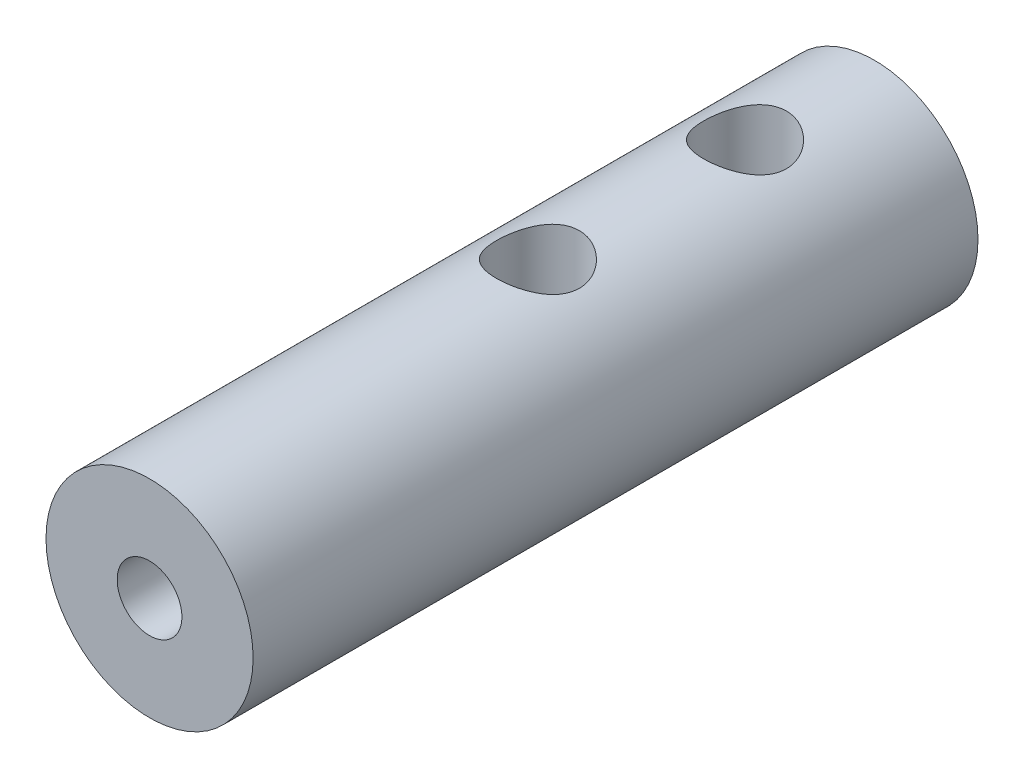
ISO-10303-21;
HEADER;
FILE_DESCRIPTION(('STEP AP214'),'2;1');
FILE_NAME('part.step','',(''),(''),'','','');
FILE_SCHEMA(('AUTOMOTIVE_DESIGN { 1 0 10303 214 1 1 1 1 }'));
ENDSEC;
DATA;
#1=APPLICATION_CONTEXT('core data for automotive mechanical design processes');
#2=APPLICATION_PROTOCOL_DEFINITION('international standard','automotive_design',2000,#1);
#3=PRODUCT_CONTEXT('',#1,'mechanical');
#4=PRODUCT('Part','Part','',(#3));
#5=PRODUCT_RELATED_PRODUCT_CATEGORY('part','',(#4));
#6=PRODUCT_DEFINITION_FORMATION('','',#4);
#7=PRODUCT_DEFINITION_CONTEXT('part definition',#1,'design');
#8=PRODUCT_DEFINITION('design','',#6,#7);
#9=PRODUCT_DEFINITION_SHAPE('','',#8);
#10=(LENGTH_UNIT() NAMED_UNIT(*) SI_UNIT(.MILLI.,.METRE.));
#11=(NAMED_UNIT(*) PLANE_ANGLE_UNIT() SI_UNIT($,.RADIAN.));
#12=(NAMED_UNIT(*) SI_UNIT($,.STERADIAN.) SOLID_ANGLE_UNIT());
#13=UNCERTAINTY_MEASURE_WITH_UNIT(LENGTH_MEASURE(1.E-05),#10,'distance_accuracy_value','');
#14=(GEOMETRIC_REPRESENTATION_CONTEXT(3) GLOBAL_UNCERTAINTY_ASSIGNED_CONTEXT((#13)) GLOBAL_UNIT_ASSIGNED_CONTEXT((#10,
#11,#12)) REPRESENTATION_CONTEXT('',''));
#15=CARTESIAN_POINT('',(0.,0.,0.));
#16=DIRECTION('',(0.,0.,1.));
#17=DIRECTION('',(1.,0.,0.));
#18=AXIS2_PLACEMENT_3D('',#15,#16,#17);
#19=CARTESIAN_POINT('',(0.,0.,28.));
#20=DIRECTION('',(0.,0.,-1.));
#21=DIRECTION('',(-1.,0.,0.));
#22=AXIS2_PLACEMENT_3D('',#19,#20,#21);
#23=CYLINDRICAL_SURFACE('',#22,4.);
#24=CARTESIAN_POINT('',(0.,-4.,6.6));
#25=CARTESIAN_POINT('',(0.085994404354313,-3.99999416981668,6.59999211854102));
#26=CARTESIAN_POINT('',(0.172138051272539,-3.99719435445546,6.5930257983293));
#27=CARTESIAN_POINT('',(0.341997184334317,-3.98626762480513,6.56540183718301));
#28=CARTESIAN_POINT('',(0.425705422048998,-3.97812622959102,6.54470697673109));
#29=CARTESIAN_POINT('',(0.587963138181922,-3.95739367370495,6.49049913755294));
#30=CARTESIAN_POINT('',(0.666528529293567,-3.94481709091258,6.45702812302662));
#31=CARTESIAN_POINT('',(0.816857576262694,-3.91645288636863,6.37838466133876));
#32=CARTESIAN_POINT('',(0.888623581400794,-3.90066637966445,6.33321627606486));
#33=CARTESIAN_POINT('',(1.02680080605631,-3.86664708936335,6.23021160115125));
#34=CARTESIAN_POINT('',(1.09284981804017,-3.84833837543352,6.17191467500779));
#35=CARTESIAN_POINT('',(1.21454000382778,-3.81168461524956,6.04527999721858));
#36=CARTESIAN_POINT('',(1.27017608570683,-3.79333955563034,5.97693736223061));
#37=CARTESIAN_POINT('',(1.3718996538343,-3.75778233437709,5.82845754380619));
#38=CARTESIAN_POINT('',(1.41745198495638,-3.74065692771961,5.74793081118144));
#39=CARTESIAN_POINT('',(1.49420377522972,-3.71066917749434,5.57957088126397));
#40=CARTESIAN_POINT('',(1.52541005142867,-3.69780480995341,5.49174117772131));
#41=CARTESIAN_POINT('',(1.57111905871669,-3.67861086128655,5.31543013312632));
#42=CARTESIAN_POINT('',(1.58631517264452,-3.67201136284484,5.22715901153903));
#43=CARTESIAN_POINT('',(1.60173836931202,-3.66531203239315,5.04909200135419));
#44=CARTESIAN_POINT('',(1.60197281305058,-3.66520900418215,4.95929688429999));
#45=CARTESIAN_POINT('',(1.58799149400364,-3.67128400223995,4.78739466283357));
#46=CARTESIAN_POINT('',(1.57478025144411,-3.6770254003076,4.70518742847278));
#47=CARTESIAN_POINT('',(1.53595750423826,-3.69340950086269,4.54427235519463));
#48=CARTESIAN_POINT('',(1.5103438358437,-3.70405305857338,4.46556512951175));
#49=CARTESIAN_POINT('',(1.44695578604086,-3.72927588070824,4.31198573104317));
#50=CARTESIAN_POINT('',(1.40894388985225,-3.7439310342463,4.23722460875625));
#51=CARTESIAN_POINT('',(1.32200516858577,-3.77550493111912,4.09486734691075));
#52=CARTESIAN_POINT('',(1.27307424408067,-3.79242452365479,4.02727391247776));
#53=CARTESIAN_POINT('',(1.16124047956355,-3.82821389393817,3.8956722169584));
#54=CARTESIAN_POINT('',(1.09754997037651,-3.84713331980921,3.83234501644319));
#55=CARTESIAN_POINT('',(0.960251541944154,-3.88367859966626,3.71705241759837));
#56=CARTESIAN_POINT('',(0.886641652267547,-3.9013041955626,3.66508928207177));
#57=CARTESIAN_POINT('',(0.729662122084675,-3.93371745011639,3.57310604206734));
#58=CARTESIAN_POINT('',(0.646128393077182,-3.94844216076332,3.53334217504236));
#59=CARTESIAN_POINT('',(0.472819012386306,-3.97291862663007,3.46866571113756));
#60=CARTESIAN_POINT('',(0.383046557479739,-3.98267290769906,3.44374556995407));
#61=CARTESIAN_POINT('',(0.205516710086256,-3.99564911605528,3.41084136366424));
#62=CARTESIAN_POINT('',(0.117954635188428,-3.99922356666811,3.40194203659715));
#63=CARTESIAN_POINT('',(-0.0574762478462539,-4.00054782808505,3.39862951957711));
#64=CARTESIAN_POINT('',(-0.145344970579139,-3.99829914865833,3.40421257476199));
#65=CARTESIAN_POINT('',(-0.31474619129759,-3.98846053651002,3.42903340204159));
#66=CARTESIAN_POINT('',(-0.39638599342038,-3.98111513076419,3.44764638428078));
#67=CARTESIAN_POINT('',(-0.555308342448625,-3.962075531244,3.49714856664785));
#68=CARTESIAN_POINT('',(-0.632590328179876,-3.95038077885224,3.52803934373495));
#69=CARTESIAN_POINT('',(-0.783263028653362,-3.92333275816649,3.60222795174396));
#70=CARTESIAN_POINT('',(-0.856462418204325,-3.90787852783843,3.64587637763452));
#71=CARTESIAN_POINT('',(-0.994754872997244,-3.8749869179642,3.74395225912452));
#72=CARTESIAN_POINT('',(-1.0598446726089,-3.85754874488216,3.79838403433809));
#73=CARTESIAN_POINT('',(-1.18457843442306,-3.82116094110489,3.9206960103597));
#74=CARTESIAN_POINT('',(-1.24357914704485,-3.80218753140042,3.98922683320497));
#75=CARTESIAN_POINT('',(-1.34940095793097,-3.76593338333706,4.1355520664075));
#76=CARTESIAN_POINT('',(-1.39622004907001,-3.74865292421209,4.21334800027196));
#77=CARTESIAN_POINT('',(-1.4766460015453,-3.71771439926167,4.37716935567528));
#78=CARTESIAN_POINT('',(-1.51012047562756,-3.7040930470783,4.46326719936985));
#79=CARTESIAN_POINT('',(-1.56183697576424,-3.68258938782345,4.64058692137213));
#80=CARTESIAN_POINT('',(-1.58009024421545,-3.67470284556799,4.73180496464994));
#81=CARTESIAN_POINT('',(-1.59977249382272,-3.66617407439941,4.90970232141964));
#82=CARTESIAN_POINT('',(-1.60231766584229,-3.66505136806537,4.99623587167468));
#83=CARTESIAN_POINT('',(-1.59344252742202,-3.66891868826478,5.16843588617064));
#84=CARTESIAN_POINT('',(-1.58202399033103,-3.67390793859835,5.25410245912207));
#85=CARTESIAN_POINT('',(-1.54645709292292,-3.68901319263217,5.41866575188403));
#86=CARTESIAN_POINT('',(-1.52282999485678,-3.69891865461959,5.4976962195464));
#87=CARTESIAN_POINT('',(-1.46400435879281,-3.72259200986157,5.65070290369079));
#88=CARTESIAN_POINT('',(-1.42880262511505,-3.73636096964805,5.72467771751986));
#89=CARTESIAN_POINT('',(-1.34549821020778,-3.76718887683593,5.87008769541662));
#90=CARTESIAN_POINT('',(-1.29677226812759,-3.78439105850594,5.94113493610439));
#91=CARTESIAN_POINT('',(-1.1887136954172,-3.8197104349779,6.07439465376301));
#92=CARTESIAN_POINT('',(-1.1293778678545,-3.83782790438725,6.13660445770265));
#93=CARTESIAN_POINT('',(-0.99720440501797,-3.87434853669915,6.25456228261089));
#94=CARTESIAN_POINT('',(-0.923740800916911,-3.89269406369748,6.30962984551846));
#95=CARTESIAN_POINT('',(-0.767920256228624,-3.92640325370973,6.40666963409731));
#96=CARTESIAN_POINT('',(-0.68555920363779,-3.94176552874325,6.44863576972202));
#97=CARTESIAN_POINT('',(-0.515790449996162,-3.96751771852689,6.51729777215223));
#98=CARTESIAN_POINT('',(-0.428505294575756,-3.97799490444022,6.54426345884827));
#99=CARTESIAN_POINT('',(-0.250301237024976,-3.99315444967493,6.58291129676341));
#100=CARTESIAN_POINT('',(-0.15939482068713,-3.9978551959651,6.59464194939512));
#101=CARTESIAN_POINT('',(-0.0455298383127434,-3.99980719603309,6.59951630478262));
#102=CARTESIAN_POINT('',(-0.0227701509926065,-4.00000154375341,6.60000208690336));
#103=CARTESIAN_POINT('',(0.,-4.,6.6));
#104=B_SPLINE_CURVE_WITH_KNOTS('',3,(#24,#25,#26,#27,#28,#29,#30,#31,#32,#33,#34,#35,#36,#37,
#38,#39,#40,#41,#42,#43,#44,#45,#46,#47,#48,#49,#50,#51,#52,#53,#54,#55,#56,#57,#58,#59,#60,#61,
#62,#63,#64,#65,#66,#67,#68,#69,#70,#71,#72,#73,#74,#75,#76,#77,#78,#79,#80,#81,#82,#83,#84,#85,
#86,#87,#88,#89,#90,#91,#92,#93,#94,#95,#96,#97,#98,#99,#100,#101,#102,#103),.UNSPECIFIED.,.T.,
.F.,(4,2,2,2,2,2,2,2,2,2,2,2,2,2,2,2,2,2,2,2,2,2,2,2,2,2,2,2,2,2,2,2,2,2,2,2,2,2,2,4),(0.,
0.257922390314457,0.516546908806348,0.774329165977265,1.03202202854387,1.30077905360318,
1.56966715947529,1.85052207055373,2.13124338494614,2.39923284247063,2.6670904507239,
2.91630662721098,3.16556629804838,3.41991301039053,3.67435537550547,3.94846679349245,
4.22263274271786,4.50221530530245,4.78165564891032,5.04455347622406,5.30738314856066,
5.55840364451492,5.80945639195037,6.0681881071861,6.32702367599175,6.60294779699531,
6.87891735234998,7.15756036112662,7.43599738116747,7.69439738714198,7.95276458050436,
8.20091454839015,8.44913308644129,8.71156374445354,8.97407361078715,9.25360338827069,
9.53326290912426,9.80771440810655,10.0812900192347,10.1495843671744),.UNSPECIFIED.);
#105=CARTESIAN_POINT('',(0.,-4.,6.6));
#106=VERTEX_POINT('',#105);
#107=EDGE_CURVE('E10',#106,#106,#104,.T.);
#108=ORIENTED_EDGE('',*,*,#107,.T.);
#109=EDGE_LOOP('',(#108));
#110=FACE_BOUND('',#109,.T.);
#111=CARTESIAN_POINT('',(0.,4.,6.6));
#112=CARTESIAN_POINT('',(-0.085994404354313,3.99999416981668,6.59999211854102));
#113=CARTESIAN_POINT('',(-0.172138051272539,3.99719435445546,6.5930257983293));
#114=CARTESIAN_POINT('',(-0.341997184334317,3.98626762480513,6.56540183718301));
#115=CARTESIAN_POINT('',(-0.425705422048998,3.97812622959102,6.54470697673109));
#116=CARTESIAN_POINT('',(-0.587963138181922,3.95739367370495,6.49049913755294));
#117=CARTESIAN_POINT('',(-0.666528529293567,3.94481709091258,6.45702812302662));
#118=CARTESIAN_POINT('',(-0.816857576262694,3.91645288636863,6.37838466133876));
#119=CARTESIAN_POINT('',(-0.888623581400794,3.90066637966445,6.33321627606486));
#120=CARTESIAN_POINT('',(-1.02680080605631,3.86664708936335,6.23021160115125));
#121=CARTESIAN_POINT('',(-1.09284981804017,3.84833837543352,6.17191467500779));
#122=CARTESIAN_POINT('',(-1.21454000382778,3.81168461524956,6.04527999721858));
#123=CARTESIAN_POINT('',(-1.27017608570683,3.79333955563034,5.97693736223061));
#124=CARTESIAN_POINT('',(-1.3718996538343,3.75778233437709,5.82845754380619));
#125=CARTESIAN_POINT('',(-1.41745198495638,3.74065692771961,5.74793081118144));
#126=CARTESIAN_POINT('',(-1.49420377522972,3.71066917749434,5.57957088126397));
#127=CARTESIAN_POINT('',(-1.52541005142867,3.69780480995341,5.49174117772131));
#128=CARTESIAN_POINT('',(-1.57111905871669,3.67861086128655,5.31543013312632));
#129=CARTESIAN_POINT('',(-1.58631517264452,3.67201136284484,5.22715901153903));
#130=CARTESIAN_POINT('',(-1.60173836931202,3.66531203239315,5.04909200135419));
#131=CARTESIAN_POINT('',(-1.60197281305058,3.66520900418215,4.95929688429999));
#132=CARTESIAN_POINT('',(-1.58799149400364,3.67128400223995,4.78739466283357));
#133=CARTESIAN_POINT('',(-1.57478025144411,3.6770254003076,4.70518742847278));
#134=CARTESIAN_POINT('',(-1.53595750423826,3.69340950086269,4.54427235519463));
#135=CARTESIAN_POINT('',(-1.5103438358437,3.70405305857338,4.46556512951175));
#136=CARTESIAN_POINT('',(-1.44695578604086,3.72927588070824,4.31198573104317));
#137=CARTESIAN_POINT('',(-1.40894388985225,3.7439310342463,4.23722460875625));
#138=CARTESIAN_POINT('',(-1.32200516858577,3.77550493111912,4.09486734691075));
#139=CARTESIAN_POINT('',(-1.27307424408067,3.79242452365479,4.02727391247776));
#140=CARTESIAN_POINT('',(-1.16124047956355,3.82821389393817,3.8956722169584));
#141=CARTESIAN_POINT('',(-1.09754997037651,3.84713331980921,3.83234501644319));
#142=CARTESIAN_POINT('',(-0.960251541944154,3.88367859966626,3.71705241759837));
#143=CARTESIAN_POINT('',(-0.886641652267547,3.9013041955626,3.66508928207177));
#144=CARTESIAN_POINT('',(-0.729662122084675,3.93371745011639,3.57310604206734));
#145=CARTESIAN_POINT('',(-0.646128393077182,3.94844216076332,3.53334217504236));
#146=CARTESIAN_POINT('',(-0.472819012386306,3.97291862663007,3.46866571113756));
#147=CARTESIAN_POINT('',(-0.383046557479739,3.98267290769906,3.44374556995407));
#148=CARTESIAN_POINT('',(-0.205516710086256,3.99564911605528,3.41084136366424));
#149=CARTESIAN_POINT('',(-0.117954635188428,3.99922356666811,3.40194203659715));
#150=CARTESIAN_POINT('',(0.0574762478462539,4.00054782808505,3.39862951957711));
#151=CARTESIAN_POINT('',(0.145344970579139,3.99829914865833,3.40421257476199));
#152=CARTESIAN_POINT('',(0.31474619129759,3.98846053651002,3.42903340204159));
#153=CARTESIAN_POINT('',(0.39638599342038,3.98111513076419,3.44764638428078));
#154=CARTESIAN_POINT('',(0.555308342448625,3.962075531244,3.49714856664785));
#155=CARTESIAN_POINT('',(0.632590328179876,3.95038077885224,3.52803934373495));
#156=CARTESIAN_POINT('',(0.783263028653362,3.92333275816649,3.60222795174396));
#157=CARTESIAN_POINT('',(0.856462418204325,3.90787852783843,3.64587637763452));
#158=CARTESIAN_POINT('',(0.994754872997244,3.8749869179642,3.74395225912452));
#159=CARTESIAN_POINT('',(1.0598446726089,3.85754874488216,3.79838403433809));
#160=CARTESIAN_POINT('',(1.18457843442306,3.82116094110489,3.9206960103597));
#161=CARTESIAN_POINT('',(1.24357914704485,3.80218753140042,3.98922683320497));
#162=CARTESIAN_POINT('',(1.34940095793097,3.76593338333706,4.1355520664075));
#163=CARTESIAN_POINT('',(1.39622004907001,3.74865292421209,4.21334800027196));
#164=CARTESIAN_POINT('',(1.4766460015453,3.71771439926167,4.37716935567528));
#165=CARTESIAN_POINT('',(1.51012047562756,3.7040930470783,4.46326719936985));
#166=CARTESIAN_POINT('',(1.56183697576424,3.68258938782345,4.64058692137213));
#167=CARTESIAN_POINT('',(1.58009024421545,3.67470284556799,4.73180496464994));
#168=CARTESIAN_POINT('',(1.59977249382272,3.66617407439941,4.90970232141964));
#169=CARTESIAN_POINT('',(1.60231766584229,3.66505136806537,4.99623587167468));
#170=CARTESIAN_POINT('',(1.59344252742202,3.66891868826478,5.16843588617064));
#171=CARTESIAN_POINT('',(1.58202399033103,3.67390793859835,5.25410245912207));
#172=CARTESIAN_POINT('',(1.54645709292292,3.68901319263217,5.41866575188403));
#173=CARTESIAN_POINT('',(1.52282999485678,3.69891865461959,5.4976962195464));
#174=CARTESIAN_POINT('',(1.46400435879281,3.72259200986157,5.65070290369079));
#175=CARTESIAN_POINT('',(1.42880262511505,3.73636096964805,5.72467771751986));
#176=CARTESIAN_POINT('',(1.34549821020778,3.76718887683593,5.87008769541662));
#177=CARTESIAN_POINT('',(1.29677226812759,3.78439105850594,5.94113493610439));
#178=CARTESIAN_POINT('',(1.1887136954172,3.8197104349779,6.07439465376301));
#179=CARTESIAN_POINT('',(1.1293778678545,3.83782790438725,6.13660445770265));
#180=CARTESIAN_POINT('',(0.99720440501797,3.87434853669915,6.25456228261089));
#181=CARTESIAN_POINT('',(0.923740800916911,3.89269406369748,6.30962984551846));
#182=CARTESIAN_POINT('',(0.767920256228624,3.92640325370973,6.40666963409731));
#183=CARTESIAN_POINT('',(0.68555920363779,3.94176552874325,6.44863576972202));
#184=CARTESIAN_POINT('',(0.515790449996162,3.96751771852689,6.51729777215223));
#185=CARTESIAN_POINT('',(0.428505294575756,3.97799490444022,6.54426345884827));
#186=CARTESIAN_POINT('',(0.250301237024976,3.99315444967493,6.58291129676341));
#187=CARTESIAN_POINT('',(0.15939482068713,3.9978551959651,6.59464194939512));
#188=CARTESIAN_POINT('',(0.0455298383127434,3.99980719603309,6.59951630478262));
#189=CARTESIAN_POINT('',(0.0227701509926065,4.00000154375341,6.60000208690336));
#190=CARTESIAN_POINT('',(0.,4.,6.6));
#191=B_SPLINE_CURVE_WITH_KNOTS('',3,(#111,#112,#113,#114,#115,#116,#117,#118,#119,#120,#121,
#122,#123,#124,#125,#126,#127,#128,#129,#130,#131,#132,#133,#134,#135,#136,#137,#138,#139,#140,
#141,#142,#143,#144,#145,#146,#147,#148,#149,#150,#151,#152,#153,#154,#155,#156,#157,#158,#159,
#160,#161,#162,#163,#164,#165,#166,#167,#168,#169,#170,#171,#172,#173,#174,#175,#176,#177,#178,
#179,#180,#181,#182,#183,#184,#185,#186,#187,#188,#189,#190),.UNSPECIFIED.,.T.,.F.,(4,2,2,2,2,2,
2,2,2,2,2,2,2,2,2,2,2,2,2,2,2,2,2,2,2,2,2,2,2,2,2,2,2,2,2,2,2,2,2,4),(0.,0.257922390314457,
0.516546908806348,0.774329165977265,1.03202202854387,1.30077905360318,1.56966715947529,
1.85052207055373,2.13124338494614,2.39923284247063,2.6670904507239,2.91630662721098,
3.16556629804838,3.41991301039053,3.67435537550547,3.94846679349245,4.22263274271786,
4.50221530530245,4.78165564891032,5.04455347622406,5.30738314856066,5.55840364451492,
5.80945639195037,6.0681881071861,6.32702367599175,6.60294779699531,6.87891735234998,
7.15756036112662,7.43599738116747,7.69439738714198,7.95276458050436,8.20091454839015,
8.44913308644129,8.71156374445354,8.97407361078715,9.25360338827069,9.53326290912426,
9.80771440810655,10.0812900192347,10.1495843671744),.UNSPECIFIED.);
#192=CARTESIAN_POINT('',(0.,4.,6.6));
#193=VERTEX_POINT('',#192);
#194=EDGE_CURVE('E41',#193,#193,#191,.T.);
#195=ORIENTED_EDGE('',*,*,#194,.T.);
#196=EDGE_LOOP('',(#195));
#197=FACE_BOUND('',#196,.T.);
#198=CARTESIAN_POINT('',(0.,-4.,14.6));
#199=CARTESIAN_POINT('',(0.0859944043543129,-3.99999416981668,14.599992118541));
#200=CARTESIAN_POINT('',(0.172138051272538,-3.99719435445546,14.5930257983293));
#201=CARTESIAN_POINT('',(0.341997184334316,-3.98626762480513,14.565401837183));
#202=CARTESIAN_POINT('',(0.425705422048998,-3.97812622959102,14.5447069767311));
#203=CARTESIAN_POINT('',(0.587963138181923,-3.95739367370495,14.4904991375529));
#204=CARTESIAN_POINT('',(0.666528529293567,-3.94481709091258,14.4570281230266));
#205=CARTESIAN_POINT('',(0.816857576262694,-3.91645288636862,14.3783846613388));
#206=CARTESIAN_POINT('',(0.888623581400794,-3.90066637966445,14.3332162760649));
#207=CARTESIAN_POINT('',(1.02680080605631,-3.86664708936335,14.2302116011513));
#208=CARTESIAN_POINT('',(1.09284981804017,-3.84833837543352,14.1719146750078));
#209=CARTESIAN_POINT('',(1.21454000382778,-3.81168461524956,14.0452799972186));
#210=CARTESIAN_POINT('',(1.27017608570683,-3.79333955563034,13.9769373622306));
#211=CARTESIAN_POINT('',(1.3718996538343,-3.75778233437709,13.8284575438062));
#212=CARTESIAN_POINT('',(1.41745198495638,-3.74065692771961,13.7479308111814));
#213=CARTESIAN_POINT('',(1.49420377522972,-3.71066917749434,13.579570881264));
#214=CARTESIAN_POINT('',(1.52541005142867,-3.69780480995341,13.4917411777213));
#215=CARTESIAN_POINT('',(1.57111905871669,-3.67861086128655,13.3154301331263));
#216=CARTESIAN_POINT('',(1.58631517264452,-3.67201136284484,13.227159011539));
#217=CARTESIAN_POINT('',(1.60173836931202,-3.66531203239315,13.0490920013542));
#218=CARTESIAN_POINT('',(1.60197281305058,-3.66520900418215,12.9592968843));
#219=CARTESIAN_POINT('',(1.58799149400364,-3.67128400223995,12.7873946628336));
#220=CARTESIAN_POINT('',(1.57478025144411,-3.6770254003076,12.7051874284728));
#221=CARTESIAN_POINT('',(1.53595750423826,-3.69340950086269,12.5442723551946));
#222=CARTESIAN_POINT('',(1.5103438358437,-3.70405305857338,12.4655651295118));
#223=CARTESIAN_POINT('',(1.44695578604086,-3.72927588070824,12.3119857310432));
#224=CARTESIAN_POINT('',(1.40894388985225,-3.7439310342463,12.2372246087562));
#225=CARTESIAN_POINT('',(1.32200516858577,-3.77550493111912,12.0948673469107));
#226=CARTESIAN_POINT('',(1.27307424408068,-3.79242452365479,12.0272739124778));
#227=CARTESIAN_POINT('',(1.16124047956355,-3.82821389393817,11.8956722169584));
#228=CARTESIAN_POINT('',(1.09754997037651,-3.84713331980921,11.8323450164432));
#229=CARTESIAN_POINT('',(0.960251541944156,-3.88367859966626,11.7170524175984));
#230=CARTESIAN_POINT('',(0.886641652267548,-3.9013041955626,11.6650892820718));
#231=CARTESIAN_POINT('',(0.729662122084675,-3.93371745011639,11.5731060420673));
#232=CARTESIAN_POINT('',(0.646128393077182,-3.94844216076332,11.5333421750424));
#233=CARTESIAN_POINT('',(0.472819012386306,-3.97291862663007,11.4686657111376));
#234=CARTESIAN_POINT('',(0.38304655747974,-3.98267290769906,11.4437455699541));
#235=CARTESIAN_POINT('',(0.205516710086257,-3.99564911605528,11.4108413636642));
#236=CARTESIAN_POINT('',(0.117954635188428,-3.99922356666811,11.4019420365972));
#237=CARTESIAN_POINT('',(-0.0574762478462531,-4.00054782808505,11.3986295195771));
#238=CARTESIAN_POINT('',(-0.145344970579138,-3.99829914865833,11.404212574762));
#239=CARTESIAN_POINT('',(-0.31474619129759,-3.98846053651002,11.4290334020416));
#240=CARTESIAN_POINT('',(-0.396385993420379,-3.98111513076419,11.4476463842808));
#241=CARTESIAN_POINT('',(-0.555308342448624,-3.962075531244,11.4971485666479));
#242=CARTESIAN_POINT('',(-0.632590328179875,-3.95038077885224,11.5280393437349));
#243=CARTESIAN_POINT('',(-0.783263028653362,-3.92333275816649,11.602227951744));
#244=CARTESIAN_POINT('',(-0.856462418204325,-3.90787852783843,11.6458763776345));
#245=CARTESIAN_POINT('',(-0.994754872997245,-3.8749869179642,11.7439522591245));
#246=CARTESIAN_POINT('',(-1.0598446726089,-3.85754874488216,11.7983840343381));
#247=CARTESIAN_POINT('',(-1.18457843442305,-3.82116094110489,11.9206960103597));
#248=CARTESIAN_POINT('',(-1.24357914704485,-3.80218753140042,11.989226833205));
#249=CARTESIAN_POINT('',(-1.34940095793097,-3.76593338333706,12.1355520664075));
#250=CARTESIAN_POINT('',(-1.39622004907001,-3.74865292421209,12.213348000272));
#251=CARTESIAN_POINT('',(-1.4766460015453,-3.71771439926167,12.3771693556753));
#252=CARTESIAN_POINT('',(-1.51012047562756,-3.7040930470783,12.4632671993698));
#253=CARTESIAN_POINT('',(-1.56183697576424,-3.68258938782345,12.6405869213721));
#254=CARTESIAN_POINT('',(-1.58009024421545,-3.67470284556799,12.7318049646499));
#255=CARTESIAN_POINT('',(-1.59977249382272,-3.66617407439941,12.9097023214196));
#256=CARTESIAN_POINT('',(-1.60231766584229,-3.66505136806537,12.9962358716747));
#257=CARTESIAN_POINT('',(-1.59344252742202,-3.66891868826478,13.1684358861706));
#258=CARTESIAN_POINT('',(-1.58202399033103,-3.67390793859835,13.2541024591221));
#259=CARTESIAN_POINT('',(-1.54645709292292,-3.68901319263217,13.418665751884));
#260=CARTESIAN_POINT('',(-1.52282999485678,-3.69891865461959,13.4976962195464));
#261=CARTESIAN_POINT('',(-1.46400435879281,-3.72259200986157,13.6507029036908));
#262=CARTESIAN_POINT('',(-1.42880262511505,-3.73636096964805,13.7246777175199));
#263=CARTESIAN_POINT('',(-1.34549821020778,-3.76718887683593,13.8700876954166));
#264=CARTESIAN_POINT('',(-1.29677226812759,-3.78439105850594,13.9411349361044));
#265=CARTESIAN_POINT('',(-1.1887136954172,-3.8197104349779,14.074394653763));
#266=CARTESIAN_POINT('',(-1.1293778678545,-3.83782790438725,14.1366044577027));
#267=CARTESIAN_POINT('',(-0.997204405017971,-3.87434853669915,14.2545622826109));
#268=CARTESIAN_POINT('',(-0.923740800916911,-3.89269406369748,14.3096298455185));
#269=CARTESIAN_POINT('',(-0.767920256228624,-3.92640325370973,14.4066696340973));
#270=CARTESIAN_POINT('',(-0.685559203637791,-3.94176552874325,14.448635769722));
#271=CARTESIAN_POINT('',(-0.515790449996163,-3.96751771852689,14.5172977721522));
#272=CARTESIAN_POINT('',(-0.428505294575757,-3.97799490444022,14.5442634588483));
#273=CARTESIAN_POINT('',(-0.250301237024977,-3.99315444967493,14.5829112967634));
#274=CARTESIAN_POINT('',(-0.159394820687131,-3.9978551959651,14.5946419493951));
#275=CARTESIAN_POINT('',(-0.0455298383127442,-3.99980719603309,14.5995163047826));
#276=CARTESIAN_POINT('',(-0.022770150992607,-4.00000154375341,14.6000020869034));
#277=CARTESIAN_POINT('',(0.,-4.,14.6));
#278=B_SPLINE_CURVE_WITH_KNOTS('',3,(#198,#199,#200,#201,#202,#203,#204,#205,#206,#207,#208,
#209,#210,#211,#212,#213,#214,#215,#216,#217,#218,#219,#220,#221,#222,#223,#224,#225,#226,#227,
#228,#229,#230,#231,#232,#233,#234,#235,#236,#237,#238,#239,#240,#241,#242,#243,#244,#245,#246,
#247,#248,#249,#250,#251,#252,#253,#254,#255,#256,#257,#258,#259,#260,#261,#262,#263,#264,#265,
#266,#267,#268,#269,#270,#271,#272,#273,#274,#275,#276,#277),.UNSPECIFIED.,.T.,.F.,(4,2,2,2,2,2,
2,2,2,2,2,2,2,2,2,2,2,2,2,2,2,2,2,2,2,2,2,2,2,2,2,2,2,2,2,2,2,2,2,4),(0.,0.257922390314457,
0.516546908806348,0.774329165977265,1.03202202854387,1.30077905360318,1.56966715947529,
1.85052207055374,2.13124338494614,2.39923284247063,2.6670904507239,2.91630662721098,
3.16556629804838,3.41991301039053,3.67435537550546,3.94846679349245,4.22263274271786,
4.50221530530245,4.78165564891032,5.04455347622406,5.30738314856066,5.55840364451492,
5.80945639195037,6.0681881071861,6.32702367599175,6.60294779699531,6.87891735234998,
7.15756036112662,7.43599738116747,7.69439738714198,7.95276458050436,8.20091454839015,
8.44913308644129,8.71156374445354,8.97407361078715,9.25360338827069,9.53326290912426,
9.80771440810655,10.0812900192347,10.1495843671744),.UNSPECIFIED.);
#279=CARTESIAN_POINT('',(0.,-4.,14.6));
#280=VERTEX_POINT('',#279);
#281=EDGE_CURVE('E45',#280,#280,#278,.T.);
#282=ORIENTED_EDGE('',*,*,#281,.T.);
#283=EDGE_LOOP('',(#282));
#284=FACE_BOUND('',#283,.T.);
#285=CARTESIAN_POINT('',(0.,4.,14.6));
#286=CARTESIAN_POINT('',(-0.0859944043543129,3.99999416981668,14.599992118541));
#287=CARTESIAN_POINT('',(-0.172138051272538,3.99719435445546,14.5930257983293));
#288=CARTESIAN_POINT('',(-0.341997184334316,3.98626762480513,14.565401837183));
#289=CARTESIAN_POINT('',(-0.425705422048998,3.97812622959102,14.5447069767311));
#290=CARTESIAN_POINT('',(-0.587963138181923,3.95739367370495,14.4904991375529));
#291=CARTESIAN_POINT('',(-0.666528529293567,3.94481709091258,14.4570281230266));
#292=CARTESIAN_POINT('',(-0.816857576262694,3.91645288636862,14.3783846613388));
#293=CARTESIAN_POINT('',(-0.888623581400794,3.90066637966445,14.3332162760649));
#294=CARTESIAN_POINT('',(-1.02680080605631,3.86664708936335,14.2302116011513));
#295=CARTESIAN_POINT('',(-1.09284981804017,3.84833837543352,14.1719146750078));
#296=CARTESIAN_POINT('',(-1.21454000382778,3.81168461524956,14.0452799972186));
#297=CARTESIAN_POINT('',(-1.27017608570683,3.79333955563034,13.9769373622306));
#298=CARTESIAN_POINT('',(-1.3718996538343,3.75778233437709,13.8284575438062));
#299=CARTESIAN_POINT('',(-1.41745198495638,3.74065692771961,13.7479308111814));
#300=CARTESIAN_POINT('',(-1.49420377522972,3.71066917749434,13.579570881264));
#301=CARTESIAN_POINT('',(-1.52541005142867,3.69780480995341,13.4917411777213));
#302=CARTESIAN_POINT('',(-1.57111905871669,3.67861086128655,13.3154301331263));
#303=CARTESIAN_POINT('',(-1.58631517264452,3.67201136284484,13.227159011539));
#304=CARTESIAN_POINT('',(-1.60173836931202,3.66531203239315,13.0490920013542));
#305=CARTESIAN_POINT('',(-1.60197281305058,3.66520900418215,12.9592968843));
#306=CARTESIAN_POINT('',(-1.58799149400364,3.67128400223995,12.7873946628336));
#307=CARTESIAN_POINT('',(-1.57478025144411,3.6770254003076,12.7051874284728));
#308=CARTESIAN_POINT('',(-1.53595750423826,3.69340950086269,12.5442723551946));
#309=CARTESIAN_POINT('',(-1.5103438358437,3.70405305857338,12.4655651295118));
#310=CARTESIAN_POINT('',(-1.44695578604086,3.72927588070824,12.3119857310432));
#311=CARTESIAN_POINT('',(-1.40894388985225,3.7439310342463,12.2372246087562));
#312=CARTESIAN_POINT('',(-1.32200516858577,3.77550493111912,12.0948673469107));
#313=CARTESIAN_POINT('',(-1.27307424408068,3.79242452365479,12.0272739124778));
#314=CARTESIAN_POINT('',(-1.16124047956355,3.82821389393817,11.8956722169584));
#315=CARTESIAN_POINT('',(-1.09754997037651,3.84713331980921,11.8323450164432));
#316=CARTESIAN_POINT('',(-0.960251541944156,3.88367859966626,11.7170524175984));
#317=CARTESIAN_POINT('',(-0.886641652267548,3.9013041955626,11.6650892820718));
#318=CARTESIAN_POINT('',(-0.729662122084675,3.93371745011639,11.5731060420673));
#319=CARTESIAN_POINT('',(-0.646128393077182,3.94844216076332,11.5333421750424));
#320=CARTESIAN_POINT('',(-0.472819012386306,3.97291862663007,11.4686657111376));
#321=CARTESIAN_POINT('',(-0.38304655747974,3.98267290769906,11.4437455699541));
#322=CARTESIAN_POINT('',(-0.205516710086257,3.99564911605528,11.4108413636642));
#323=CARTESIAN_POINT('',(-0.117954635188428,3.99922356666811,11.4019420365972));
#324=CARTESIAN_POINT('',(0.0574762478462531,4.00054782808505,11.3986295195771));
#325=CARTESIAN_POINT('',(0.145344970579138,3.99829914865833,11.404212574762));
#326=CARTESIAN_POINT('',(0.31474619129759,3.98846053651002,11.4290334020416));
#327=CARTESIAN_POINT('',(0.396385993420379,3.98111513076419,11.4476463842808));
#328=CARTESIAN_POINT('',(0.555308342448624,3.962075531244,11.4971485666479));
#329=CARTESIAN_POINT('',(0.632590328179875,3.95038077885224,11.5280393437349));
#330=CARTESIAN_POINT('',(0.783263028653362,3.92333275816649,11.602227951744));
#331=CARTESIAN_POINT('',(0.856462418204325,3.90787852783843,11.6458763776345));
#332=CARTESIAN_POINT('',(0.994754872997245,3.8749869179642,11.7439522591245));
#333=CARTESIAN_POINT('',(1.0598446726089,3.85754874488216,11.7983840343381));
#334=CARTESIAN_POINT('',(1.18457843442305,3.82116094110489,11.9206960103597));
#335=CARTESIAN_POINT('',(1.24357914704485,3.80218753140042,11.989226833205));
#336=CARTESIAN_POINT('',(1.34940095793097,3.76593338333706,12.1355520664075));
#337=CARTESIAN_POINT('',(1.39622004907001,3.74865292421209,12.213348000272));
#338=CARTESIAN_POINT('',(1.4766460015453,3.71771439926167,12.3771693556753));
#339=CARTESIAN_POINT('',(1.51012047562756,3.7040930470783,12.4632671993698));
#340=CARTESIAN_POINT('',(1.56183697576424,3.68258938782345,12.6405869213721));
#341=CARTESIAN_POINT('',(1.58009024421545,3.67470284556799,12.7318049646499));
#342=CARTESIAN_POINT('',(1.59977249382272,3.66617407439941,12.9097023214196));
#343=CARTESIAN_POINT('',(1.60231766584229,3.66505136806537,12.9962358716747));
#344=CARTESIAN_POINT('',(1.59344252742202,3.66891868826478,13.1684358861706));
#345=CARTESIAN_POINT('',(1.58202399033103,3.67390793859835,13.2541024591221));
#346=CARTESIAN_POINT('',(1.54645709292292,3.68901319263217,13.418665751884));
#347=CARTESIAN_POINT('',(1.52282999485678,3.69891865461959,13.4976962195464));
#348=CARTESIAN_POINT('',(1.46400435879281,3.72259200986157,13.6507029036908));
#349=CARTESIAN_POINT('',(1.42880262511505,3.73636096964805,13.7246777175199));
#350=CARTESIAN_POINT('',(1.34549821020778,3.76718887683593,13.8700876954166));
#351=CARTESIAN_POINT('',(1.29677226812759,3.78439105850594,13.9411349361044));
#352=CARTESIAN_POINT('',(1.1887136954172,3.8197104349779,14.074394653763));
#353=CARTESIAN_POINT('',(1.1293778678545,3.83782790438725,14.1366044577027));
#354=CARTESIAN_POINT('',(0.997204405017971,3.87434853669915,14.2545622826109));
#355=CARTESIAN_POINT('',(0.923740800916911,3.89269406369748,14.3096298455185));
#356=CARTESIAN_POINT('',(0.767920256228624,3.92640325370973,14.4066696340973));
#357=CARTESIAN_POINT('',(0.685559203637791,3.94176552874325,14.448635769722));
#358=CARTESIAN_POINT('',(0.515790449996163,3.96751771852689,14.5172977721522));
#359=CARTESIAN_POINT('',(0.428505294575757,3.97799490444022,14.5442634588483));
#360=CARTESIAN_POINT('',(0.250301237024977,3.99315444967493,14.5829112967634));
#361=CARTESIAN_POINT('',(0.159394820687131,3.9978551959651,14.5946419493951));
#362=CARTESIAN_POINT('',(0.0455298383127442,3.99980719603309,14.5995163047826));
#363=CARTESIAN_POINT('',(0.022770150992607,4.00000154375341,14.6000020869034));
#364=CARTESIAN_POINT('',(0.,4.,14.6));
#365=B_SPLINE_CURVE_WITH_KNOTS('',3,(#285,#286,#287,#288,#289,#290,#291,#292,#293,#294,#295,
#296,#297,#298,#299,#300,#301,#302,#303,#304,#305,#306,#307,#308,#309,#310,#311,#312,#313,#314,
#315,#316,#317,#318,#319,#320,#321,#322,#323,#324,#325,#326,#327,#328,#329,#330,#331,#332,#333,
#334,#335,#336,#337,#338,#339,#340,#341,#342,#343,#344,#345,#346,#347,#348,#349,#350,#351,#352,
#353,#354,#355,#356,#357,#358,#359,#360,#361,#362,#363,#364),.UNSPECIFIED.,.T.,.F.,(4,2,2,2,2,2,
2,2,2,2,2,2,2,2,2,2,2,2,2,2,2,2,2,2,2,2,2,2,2,2,2,2,2,2,2,2,2,2,2,4),(0.,0.257922390314457,
0.516546908806348,0.774329165977265,1.03202202854387,1.30077905360318,1.56966715947529,
1.85052207055374,2.13124338494614,2.39923284247063,2.6670904507239,2.91630662721098,
3.16556629804838,3.41991301039053,3.67435537550546,3.94846679349245,4.22263274271786,
4.50221530530245,4.78165564891032,5.04455347622406,5.30738314856066,5.55840364451492,
5.80945639195037,6.0681881071861,6.32702367599175,6.60294779699531,6.87891735234998,
7.15756036112662,7.43599738116747,7.69439738714198,7.95276458050436,8.20091454839015,
8.44913308644129,8.71156374445354,8.97407361078715,9.25360338827069,9.53326290912426,
9.80771440810655,10.0812900192347,10.1495843671744),.UNSPECIFIED.);
#366=CARTESIAN_POINT('',(0.,4.,14.6));
#367=VERTEX_POINT('',#366);
#368=EDGE_CURVE('E49',#367,#367,#365,.T.);
#369=ORIENTED_EDGE('',*,*,#368,.T.);
#370=EDGE_LOOP('',(#369));
#371=FACE_BOUND('',#370,.T.);
#372=CARTESIAN_POINT('',(0.,0.,28.));
#373=DIRECTION('',(0.,0.,1.));
#374=DIRECTION('',(1.,0.,0.));
#375=AXIS2_PLACEMENT_3D('',#372,#373,#374);
#376=CIRCLE('',#375,4.);
#377=CARTESIAN_POINT('',(4.,0.,28.));
#378=VERTEX_POINT('',#377);
#379=EDGE_CURVE('E77',#378,#378,#376,.T.);
#380=ORIENTED_EDGE('',*,*,#379,.F.);
#381=EDGE_LOOP('',(#380));
#382=FACE_BOUND('',#381,.T.);
#383=CARTESIAN_POINT('',(0.,0.,0.));
#384=DIRECTION('',(0.,0.,1.));
#385=DIRECTION('',(1.,0.,0.));
#386=AXIS2_PLACEMENT_3D('',#383,#384,#385);
#387=CIRCLE('',#386,4.);
#388=CARTESIAN_POINT('',(4.,0.,0.));
#389=VERTEX_POINT('',#388);
#390=EDGE_CURVE('E78',#389,#389,#387,.T.);
#391=ORIENTED_EDGE('',*,*,#390,.T.);
#392=EDGE_LOOP('',(#391));
#393=FACE_BOUND('',#392,.T.);
#394=ADVANCED_FACE('F31',(#110,#197,#284,#371,#382,#393),#23,.T.);
#395=CARTESIAN_POINT('',(0.,0.,28.));
#396=DIRECTION('',(0.,0.,1.));
#397=DIRECTION('',(1.,0.,0.));
#398=AXIS2_PLACEMENT_3D('',#395,#396,#397);
#399=PLANE('',#398);
#400=CARTESIAN_POINT('',(0.,0.,28.));
#401=DIRECTION('',(0.,0.,1.));
#402=DIRECTION('',(1.,0.,0.));
#403=AXIS2_PLACEMENT_3D('',#400,#401,#402);
#404=CIRCLE('',#403,1.25);
#405=CARTESIAN_POINT('',(1.25,0.,28.));
#406=VERTEX_POINT('',#405);
#407=EDGE_CURVE('E84',#406,#406,#404,.T.);
#408=ORIENTED_EDGE('',*,*,#407,.F.);
#409=EDGE_LOOP('',(#408));
#410=FACE_BOUND('',#409,.T.);
#411=ORIENTED_EDGE('',*,*,#379,.T.);
#412=EDGE_LOOP('',(#411));
#413=FACE_BOUND('',#412,.T.);
#414=ADVANCED_FACE('F71',(#410,#413),#399,.T.);
#415=CARTESIAN_POINT('',(0.,0.,0.));
#416=DIRECTION('',(0.,0.,1.));
#417=DIRECTION('',(1.,0.,0.));
#418=AXIS2_PLACEMENT_3D('',#415,#416,#417);
#419=PLANE('',#418);
#420=ORIENTED_EDGE('',*,*,#390,.F.);
#421=EDGE_LOOP('',(#420));
#422=FACE_BOUND('',#421,.T.);
#423=ADVANCED_FACE('F69',(#422),#419,.F.);
#424=CARTESIAN_POINT('',(0.,-4.,13.));
#425=DIRECTION('',(0.,1.,0.));
#426=DIRECTION('',(0.,0.,1.));
#427=AXIS2_PLACEMENT_3D('',#424,#425,#426);
#428=CYLINDRICAL_SURFACE('',#427,1.6);
#429=ORIENTED_EDGE('',*,*,#368,.F.);
#430=EDGE_LOOP('',(#429));
#431=FACE_BOUND('',#430,.T.);
#432=ORIENTED_EDGE('',*,*,#281,.F.);
#433=EDGE_LOOP('',(#432));
#434=FACE_BOUND('',#433,.T.);
#435=ADVANCED_FACE('F62',(#431,#434),#428,.F.);
#436=CARTESIAN_POINT('',(0.,-4.,5.));
#437=DIRECTION('',(0.,1.,0.));
#438=DIRECTION('',(0.,0.,1.));
#439=AXIS2_PLACEMENT_3D('',#436,#437,#438);
#440=CYLINDRICAL_SURFACE('',#439,1.6);
#441=ORIENTED_EDGE('',*,*,#194,.F.);
#442=EDGE_LOOP('',(#441));
#443=FACE_BOUND('',#442,.T.);
#444=ORIENTED_EDGE('',*,*,#107,.F.);
#445=EDGE_LOOP('',(#444));
#446=FACE_BOUND('',#445,.T.);
#447=ADVANCED_FACE('F57',(#443,#446),#440,.F.);
#448=CARTESIAN_POINT('',(0.,0.,20.));
#449=DIRECTION('',(0.,0.,1.));
#450=DIRECTION('',(1.,0.,0.));
#451=AXIS2_PLACEMENT_3D('',#448,#449,#450);
#452=CYLINDRICAL_SURFACE('',#451,1.25);
#453=CARTESIAN_POINT('',(0.,0.,20.));
#454=DIRECTION('',(0.,0.,1.));
#455=DIRECTION('',(1.,0.,0.));
#456=AXIS2_PLACEMENT_3D('',#453,#454,#455);
#457=CIRCLE('',#456,1.25);
#458=CARTESIAN_POINT('',(1.25,0.,20.));
#459=VERTEX_POINT('',#458);
#460=EDGE_CURVE('E81',#459,#459,#457,.T.);
#461=ORIENTED_EDGE('',*,*,#460,.F.);
#462=EDGE_LOOP('',(#461));
#463=FACE_BOUND('',#462,.T.);
#464=ORIENTED_EDGE('',*,*,#407,.T.);
#465=EDGE_LOOP('',(#464));
#466=FACE_BOUND('',#465,.T.);
#467=ADVANCED_FACE('F61',(#463,#466),#452,.F.);
#468=CARTESIAN_POINT('',(0.,0.,20.));
#469=DIRECTION('',(0.,0.,1.));
#470=DIRECTION('',(1.,0.,0.));
#471=AXIS2_PLACEMENT_3D('',#468,#469,#470);
#472=PLANE('',#471);
#473=ORIENTED_EDGE('',*,*,#460,.T.);
#474=EDGE_LOOP('',(#473));
#475=FACE_BOUND('',#474,.T.);
#476=ADVANCED_FACE('F90',(#475),#472,.T.);
#477=CLOSED_SHELL('',(#394,#414,#423,#435,#447,#467,#476));
#478=MANIFOLD_SOLID_BREP('B2',#477);
#479=ADVANCED_BREP_SHAPE_REPRESENTATION('',(#18,#478),#14);
#480=SHAPE_DEFINITION_REPRESENTATION(#9,#479);
ENDSEC;
END-ISO-10303-21;
